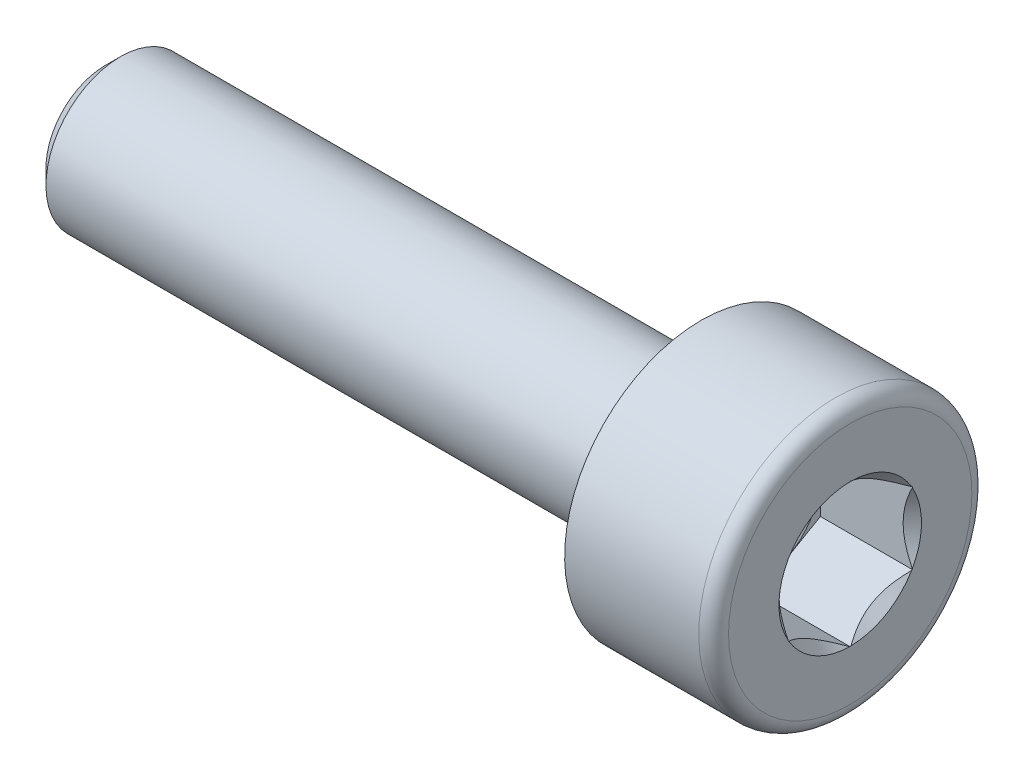
ISO-10303-21;
HEADER;
FILE_DESCRIPTION(('STEP AP214'),'2;1');
FILE_NAME('part.step','',(''),(''),'','','');
FILE_SCHEMA(('AUTOMOTIVE_DESIGN { 1 0 10303 214 1 1 1 1 }'));
ENDSEC;
DATA;
#1=APPLICATION_CONTEXT('core data for automotive mechanical design processes');
#2=APPLICATION_PROTOCOL_DEFINITION('international standard','automotive_design',2000,#1);
#3=PRODUCT_CONTEXT('',#1,'mechanical');
#4=PRODUCT('Part','Part','',(#3));
#5=PRODUCT_RELATED_PRODUCT_CATEGORY('part','',(#4));
#6=PRODUCT_DEFINITION_FORMATION('','',#4);
#7=PRODUCT_DEFINITION_CONTEXT('part definition',#1,'design');
#8=PRODUCT_DEFINITION('design','',#6,#7);
#9=PRODUCT_DEFINITION_SHAPE('','',#8);
#10=(LENGTH_UNIT() NAMED_UNIT(*) SI_UNIT(.MILLI.,.METRE.));
#11=(NAMED_UNIT(*) PLANE_ANGLE_UNIT() SI_UNIT($,.RADIAN.));
#12=(NAMED_UNIT(*) SI_UNIT($,.STERADIAN.) SOLID_ANGLE_UNIT());
#13=UNCERTAINTY_MEASURE_WITH_UNIT(LENGTH_MEASURE(1.E-05),#10,'distance_accuracy_value','');
#14=(GEOMETRIC_REPRESENTATION_CONTEXT(3) GLOBAL_UNCERTAINTY_ASSIGNED_CONTEXT((#13)) GLOBAL_UNIT_ASSIGNED_CONTEXT((#10,
#11,#12)) REPRESENTATION_CONTEXT('',''));
#15=CARTESIAN_POINT('',(0.,0.,0.));
#16=DIRECTION('',(0.,0.,1.));
#17=DIRECTION('',(1.,0.,0.));
#18=AXIS2_PLACEMENT_3D('',#15,#16,#17);
#19=CARTESIAN_POINT('',(7.04489469849211,667.387388585829,-392.357743681073));
#20=DIRECTION('',(-1.,0.,0.));
#21=DIRECTION('',(0.,0.,1.));
#22=AXIS2_PLACEMENT_3D('',#19,#20,#21);
#23=PLANE('',#22);
#24=DIRECTION('',(0.,1.,0.));
#25=VECTOR('',#24,1.);
#26=CARTESIAN_POINT('',(7.04489469849211,668.109076422316,-393.607743681073));
#27=LINE('',#26,#25);
#28=CARTESIAN_POINT('',(7.04489469885591,667.387388585829,-393.607743680855));
#29=VERTEX_POINT('',#28);
#30=CARTESIAN_POINT('',(7.04489469849211,668.109076422316,-393.607743681073));
#31=VERTEX_POINT('',#30);
#32=EDGE_CURVE('E162',#29,#31,#27,.T.);
#33=ORIENTED_EDGE('',*,*,#32,.T.);
#34=DIRECTION('',(0.,0.5,0.866025403784438));
#35=VECTOR('',#34,1.);
#36=CARTESIAN_POINT('',(7.04489469849211,668.830764258803,-392.357743681073));
#37=LINE('',#36,#35);
#38=CARTESIAN_POINT('',(7.04489469885579,668.469920340371,-392.982743680964));
#39=VERTEX_POINT('',#38);
#40=EDGE_CURVE('E158',#31,#39,#37,.T.);
#41=ORIENTED_EDGE('',*,*,#40,.T.);
#42=CARTESIAN_POINT('',(7.04489469921971,667.387388585829,-392.357743681073));
#43=DIRECTION('',(1.,2.16493489877334E-13,0.));
#44=DIRECTION('',(-2.16493489877334E-13,1.,0.));
#45=AXIS2_PLACEMENT_3D('',#42,#43,#44);
#46=CIRCLE('',#45,1.24999999956434);
#47=EDGE_CURVE('E159',#39,#29,#46,.F.);
#48=ORIENTED_EDGE('',*,*,#47,.T.);
#49=EDGE_LOOP('',(#33,#41,#48));
#50=FACE_BOUND('',#49,.T.);
#51=ADVANCED_FACE('F17',(#50),#23,.F.);
#52=CARTESIAN_POINT('',(7.04489469849211,667.387388585829,-392.357743681073));
#53=DIRECTION('',(-1.,0.,0.));
#54=DIRECTION('',(0.,0.,1.));
#55=AXIS2_PLACEMENT_3D('',#52,#53,#54);
#56=PLANE('',#55);
#57=DIRECTION('',(0.,0.5,-0.866025403784439));
#58=VECTOR('',#57,1.);
#59=CARTESIAN_POINT('',(7.04489469849211,666.665700749342,-393.607743681073));
#60=LINE('',#59,#58);
#61=CARTESIAN_POINT('',(7.04489469885608,666.304856831287,-392.982743680964));
#62=VERTEX_POINT('',#61);
#63=CARTESIAN_POINT('',(7.04489469849211,666.665700749342,-393.607743681073));
#64=VERTEX_POINT('',#63);
#65=EDGE_CURVE('E526',#62,#64,#60,.T.);
#66=ORIENTED_EDGE('',*,*,#65,.T.);
#67=DIRECTION('',(0.,1.,0.));
#68=VECTOR('',#67,1.);
#69=CARTESIAN_POINT('',(7.04489469849211,668.109076422316,-393.607743681073));
#70=LINE('',#69,#68);
#71=EDGE_CURVE('E554',#64,#29,#70,.T.);
#72=ORIENTED_EDGE('',*,*,#71,.T.);
#73=CARTESIAN_POINT('',(7.04489469921979,667.387388585829,-392.357743681073));
#74=DIRECTION('',(1.,2.16493489877334E-13,0.));
#75=DIRECTION('',(-2.16493489877334E-13,1.,0.));
#76=AXIS2_PLACEMENT_3D('',#73,#74,#75);
#77=CIRCLE('',#76,1.24999999956449);
#78=EDGE_CURVE('E177',#62,#29,#77,.T.);
#79=ORIENTED_EDGE('',*,*,#78,.F.);
#80=EDGE_LOOP('',(#66,#72,#79));
#81=FACE_BOUND('',#80,.T.);
#82=ADVANCED_FACE('F752',(#81),#56,.F.);
#83=CARTESIAN_POINT('',(7.04489469849211,668.109076422316,-393.607743681073));
#84=DIRECTION('',(0.,0.,-1.));
#85=DIRECTION('',(-1.,0.,0.));
#86=AXIS2_PLACEMENT_3D('',#83,#84,#85);
#87=PLANE('',#86);
#88=DIRECTION('',(0.,1.,0.));
#89=VECTOR('',#88,1.);
#90=CARTESIAN_POINT('',(8.89489469849247,668.109076422316,-393.607743681073));
#91=LINE('',#90,#89);
#92=CARTESIAN_POINT('',(8.89489469849247,668.109076422316,-393.607743681073));
#93=VERTEX_POINT('',#92);
#94=CARTESIAN_POINT('',(8.89489469851025,668.092175787618,-393.607743681073));
#95=VERTEX_POINT('',#94);
#96=EDGE_CURVE('E426',#93,#95,#91,.F.);
#97=ORIENTED_EDGE('',*,*,#96,.F.);
#98=DIRECTION('',(1.,0.,0.));
#99=VECTOR('',#98,1.);
#100=CARTESIAN_POINT('',(7.04489469849211,668.109076422316,-393.607743681073));
#101=LINE('',#100,#99);
#102=EDGE_CURVE('E167',#93,#31,#101,.F.);
#103=ORIENTED_EDGE('',*,*,#102,.T.);
#104=ORIENTED_EDGE('',*,*,#32,.F.);
#105=ORIENTED_EDGE('',*,*,#71,.F.);
#106=DIRECTION('',(1.,0.,0.));
#107=VECTOR('',#106,1.);
#108=CARTESIAN_POINT('',(7.04489469849211,666.665700749342,-393.607743681073));
#109=LINE('',#108,#107);
#110=CARTESIAN_POINT('',(8.89489469849247,666.665700749342,-393.607743681073));
#111=VERTEX_POINT('',#110);
#112=EDGE_CURVE('E516',#64,#111,#109,.T.);
#113=ORIENTED_EDGE('',*,*,#112,.T.);
#114=DIRECTION('',(0.,1.,0.));
#115=VECTOR('',#114,1.);
#116=CARTESIAN_POINT('',(8.89489469849247,668.109076422316,-393.607743681073));
#117=LINE('',#116,#115);
#118=CARTESIAN_POINT('',(8.89489469854452,666.682601383971,-393.607743681073));
#119=VERTEX_POINT('',#118);
#120=EDGE_CURVE('E180',#119,#111,#117,.F.);
#121=ORIENTED_EDGE('',*,*,#120,.F.);
#122=CARTESIAN_POINT('',(8.89489469855653,668.092175787723,-393.607743681083));
#123=CARTESIAN_POINT('',(8.87117991321069,668.043852206225,-393.607743681077));
#124=CARTESIAN_POINT('',(8.84888923016779,667.994735198403,-393.607743681074));
#125=CARTESIAN_POINT('',(8.80810287962849,667.894617644953,-393.607743681072));
#126=CARTESIAN_POINT('',(8.78963092965057,667.843607520204,-393.607743681073));
#127=CARTESIAN_POINT('',(8.75780168763492,667.740186947449,-393.607743681073));
#128=CARTESIAN_POINT('',(8.74442526083751,667.687782544966,-393.607743681073));
#129=CARTESIAN_POINT('',(8.72387497718193,667.581876028171,-393.607743681073));
#130=CARTESIAN_POINT('',(8.71668293816054,667.528377608385,-393.607743681073));
#131=CARTESIAN_POINT('',(8.7119254865228,667.460145309228,-393.607743681073));
#132=CARTESIAN_POINT('',(8.71116480000057,667.445601189561,-393.607743681073));
#133=CARTESIAN_POINT('',(8.71014928371903,667.416501583289,-393.607743681073));
#134=CARTESIAN_POINT('',(8.70989422450401,667.40194610484,-393.607743681073));
#135=CARTESIAN_POINT('',(8.70989593302582,667.349450798178,-393.607743681073));
#136=CARTESIAN_POINT('',(8.71163263441981,667.311499151935,-393.607743681073));
#137=CARTESIAN_POINT('',(8.71847634230468,667.23589199948,-393.607743681073));
#138=CARTESIAN_POINT('',(8.72358572479567,667.198236720992,-393.607743681073));
#139=CARTESIAN_POINT('',(8.74365016608514,667.085788613579,-393.607743681073));
#140=CARTESIAN_POINT('',(8.76333829122689,667.011814111726,-393.607743681073));
#141=CARTESIAN_POINT('',(8.80260390054921,666.895327043362,-393.607743681073));
#142=CARTESIAN_POINT('',(8.8192568604464,666.851749692749,-393.607743681073));
#143=CARTESIAN_POINT('',(8.85523377783338,666.766143984923,-393.607743681073));
#144=CARTESIAN_POINT('',(8.87453358296473,666.724105542843,-393.607743681073));
#145=CARTESIAN_POINT('',(8.89489469856133,666.682601383936,-393.607743681073));
#146=B_SPLINE_CURVE_WITH_KNOTS('',3,(#122,#123,#124,#125,#126,#127,#128,#129,#130,#131,#132,
#133,#134,#135,#136,#137,#138,#139,#140,#141,#142,#143,#144,#145),.UNSPECIFIED.,.F.,.F.,(4,2,2,
2,2,2,2,2,2,2,2,4),(0.,0.16159297621972,0.324161275223104,0.486112932561708,0.647586806321818,
0.691272786612427,0.734938937487817,0.848735605601851,0.962612527337378,1.19125625199596,
1.33113310615987,1.46980937847075),.UNSPECIFIED.);
#147=EDGE_CURVE('E421',#95,#119,#146,.T.);
#148=ORIENTED_EDGE('',*,*,#147,.F.);
#149=EDGE_LOOP('',(#97,#103,#104,#105,#113,#121,#148));
#150=FACE_BOUND('',#149,.T.);
#151=ADVANCED_FACE('F412',(#150),#87,.F.);
#152=CARTESIAN_POINT('',(7.04489469849211,668.830764258803,-392.357743681073));
#153=DIRECTION('',(0.,0.866025403784438,-0.5));
#154=DIRECTION('',(0.,0.5,0.866025403784438));
#155=AXIS2_PLACEMENT_3D('',#152,#153,#154);
#156=PLANE('',#155);
#157=DIRECTION('',(1.,0.,0.));
#158=VECTOR('',#157,1.);
#159=CARTESIAN_POINT('',(7.04489469849211,668.830764258803,-392.357743681073));
#160=LINE('',#159,#158);
#161=CARTESIAN_POINT('',(8.89489469849247,668.830764258803,-392.357743681073));
#162=VERTEX_POINT('',#161);
#163=CARTESIAN_POINT('',(7.04489469849211,668.830764258803,-392.357743681073));
#164=VERTEX_POINT('',#163);
#165=EDGE_CURVE('E172',#162,#164,#160,.F.);
#166=ORIENTED_EDGE('',*,*,#165,.T.);
#167=DIRECTION('',(0.,-0.499999999999534,-0.866025403784707));
#168=VECTOR('',#167,1.);
#169=CARTESIAN_POINT('',(7.04489469849211,668.830764258803,-392.357743681073));
#170=LINE('',#169,#168);
#171=EDGE_CURVE('E146',#164,#39,#170,.T.);
#172=ORIENTED_EDGE('',*,*,#171,.T.);
#173=ORIENTED_EDGE('',*,*,#40,.F.);
#174=ORIENTED_EDGE('',*,*,#102,.F.);
#175=DIRECTION('',(0.,0.5,0.866025403784438));
#176=VECTOR('',#175,1.);
#177=CARTESIAN_POINT('',(8.89489469849247,668.830764258803,-392.357743681073));
#178=LINE('',#177,#176);
#179=CARTESIAN_POINT('',(8.89489469854436,668.11752673963,-393.593107302144));
#180=VERTEX_POINT('',#179);
#181=EDGE_CURVE('E420',#180,#93,#178,.F.);
#182=ORIENTED_EDGE('',*,*,#181,.F.);
#183=CARTESIAN_POINT('',(8.89489469855646,668.822313941515,-392.372380059975));
#184=CARTESIAN_POINT('',(8.87117991321007,668.798152150761,-392.414229509152));
#185=CARTESIAN_POINT('',(8.84888923016683,668.773593646847,-392.456766085683));
#186=CARTESIAN_POINT('',(8.80810287962714,668.723534870119,-392.543470430336));
#187=CARTESIAN_POINT('',(8.78963092964915,668.698029807744,-392.58764649422));
#188=CARTESIAN_POINT('',(8.7578016876337,668.646319521368,-392.6772113375));
#189=CARTESIAN_POINT('',(8.7444252608364,668.620117320127,-392.72259488132));
#190=CARTESIAN_POINT('',(8.72387497718203,668.567164061729,-392.814312615289));
#191=CARTESIAN_POINT('',(8.71668293816175,668.540414851835,-392.860643605883));
#192=CARTESIAN_POINT('',(8.7119254865224,668.50629870226,-392.919734510313));
#193=CARTESIAN_POINT('',(8.71116479999966,668.499026642427,-392.932330087422));
#194=CARTESIAN_POINT('',(8.71014928371984,668.484476839288,-392.957531085692));
#195=CARTESIAN_POINT('',(8.70989422450707,668.477199100059,-392.97013649979));
#196=CARTESIAN_POINT('',(8.70989593303279,668.450951446719,-393.015598768934));
#197=CARTESIAN_POINT('',(8.71163263442171,668.431975623608,-393.048465858702));
#198=CARTESIAN_POINT('',(8.71847634230282,668.394172047388,-393.113943573441));
#199=CARTESIAN_POINT('',(8.72358572479509,668.375344408142,-393.146554001196));
#200=CARTESIAN_POINT('',(8.74365016608657,668.319120354432,-393.243936918821));
#201=CARTESIAN_POINT('',(8.7633382912272,668.282133103507,-393.308000716659));
#202=CARTESIAN_POINT('',(8.80260390054881,668.223889569326,-393.408881477075));
#203=CARTESIAN_POINT('',(8.81925686044601,668.20210089402,-393.446620569735));
#204=CARTESIAN_POINT('',(8.85523377783316,668.159298040107,-393.520757287421));
#205=CARTESIAN_POINT('',(8.87453358296468,668.138278819066,-393.557163646198));
#206=CARTESIAN_POINT('',(8.89489469856121,668.117526739613,-393.593107302174));
#207=B_SPLINE_CURVE_WITH_KNOTS('',3,(#183,#184,#185,#186,#187,#188,#189,#190,#191,#192,#193,
#194,#195,#196,#197,#198,#199,#200,#201,#202,#203,#204,#205,#206),.UNSPECIFIED.,.F.,.F.,(4,2,2,
2,2,2,2,2,2,2,2,4),(0.,0.16159297622278,0.324161275228295,0.486112932563936,0.64758680632166,
0.691272786612252,0.734938937487788,0.848735605602835,0.962612527338137,1.19125625199554,
1.33113310615905,1.46980937847057),.UNSPECIFIED.);
#208=CARTESIAN_POINT('',(8.89489469851013,668.822313941454,-392.372380060062));
#209=VERTEX_POINT('',#208);
#210=EDGE_CURVE('E415',#209,#180,#207,.T.);
#211=ORIENTED_EDGE('',*,*,#210,.F.);
#212=DIRECTION('',(0.,0.5,0.866025403784438));
#213=VECTOR('',#212,1.);
#214=CARTESIAN_POINT('',(8.89489469849247,668.830764258803,-392.357743681073));
#215=LINE('',#214,#213);
#216=EDGE_CURVE('E166',#162,#209,#215,.F.);
#217=ORIENTED_EDGE('',*,*,#216,.F.);
#218=EDGE_LOOP('',(#166,#172,#173,#174,#182,#211,#217));
#219=FACE_BOUND('',#218,.T.);
#220=ADVANCED_FACE('F169',(#219),#156,.F.);
#221=CARTESIAN_POINT('',(7.04489469849211,667.387388585829,-392.357743681073));
#222=DIRECTION('',(-1.,0.,0.));
#223=DIRECTION('',(0.,0.,1.));
#224=AXIS2_PLACEMENT_3D('',#221,#222,#223);
#225=PLANE('',#224);
#226=ORIENTED_EDGE('',*,*,#171,.F.);
#227=DIRECTION('',(0.,-0.5,0.866025403784439));
#228=VECTOR('',#227,1.);
#229=CARTESIAN_POINT('',(7.04489469849211,668.109076422316,-391.107743681073));
#230=LINE('',#229,#228);
#231=CARTESIAN_POINT('',(7.04489469885578,668.469920340371,-391.732743681182));
#232=VERTEX_POINT('',#231);
#233=EDGE_CURVE('E148',#164,#232,#230,.T.);
#234=ORIENTED_EDGE('',*,*,#233,.T.);
#235=CARTESIAN_POINT('',(7.04489469921969,667.387388585829,-392.357743681073));
#236=DIRECTION('',(1.,2.16493489877334E-13,0.));
#237=DIRECTION('',(-2.16493489877334E-13,1.,0.));
#238=AXIS2_PLACEMENT_3D('',#235,#236,#237);
#239=CIRCLE('',#238,1.24999999956431);
#240=EDGE_CURVE('E142',#232,#39,#239,.F.);
#241=ORIENTED_EDGE('',*,*,#240,.T.);
#242=EDGE_LOOP('',(#226,#234,#241));
#243=FACE_BOUND('',#242,.T.);
#244=ADVANCED_FACE('F144',(#243),#225,.F.);
#245=CARTESIAN_POINT('',(7.04489469921982,667.387388585829,-392.357743681073));
#246=DIRECTION('',(1.,2.16493489877334E-13,0.));
#247=DIRECTION('',(-2.16493489877334E-13,1.,0.));
#248=AXIS2_PLACEMENT_3D('',#245,#246,#247);
#249=CONICAL_SURFACE('',#248,1.24999999956454,1.04719755000191);
#250=CARTESIAN_POINT('',(7.04489469921982,667.387388585829,-392.357743681073));
#251=DIRECTION('',(1.,2.16493489877334E-13,0.));
#252=DIRECTION('',(-2.16493489877334E-13,1.,0.));
#253=AXIS2_PLACEMENT_3D('',#250,#251,#252);
#254=CIRCLE('',#253,1.24999999956454);
#255=CARTESIAN_POINT('',(7.04489469885607,666.304856831287,-391.732743681182));
#256=VERTEX_POINT('',#255);
#257=EDGE_CURVE('E153',#256,#62,#254,.T.);
#258=ORIENTED_EDGE('',*,*,#257,.T.);
#259=ORIENTED_EDGE('',*,*,#78,.T.);
#260=ORIENTED_EDGE('',*,*,#47,.F.);
#261=ORIENTED_EDGE('',*,*,#240,.F.);
#262=CARTESIAN_POINT('',(7.04489469921976,667.387388585829,-392.357743681073));
#263=DIRECTION('',(1.,2.16493489877334E-13,0.));
#264=DIRECTION('',(-2.16493489877334E-13,1.,0.));
#265=AXIS2_PLACEMENT_3D('',#262,#263,#264);
#266=CIRCLE('',#265,1.24999999956443);
#267=CARTESIAN_POINT('',(7.04489469885594,667.387388585829,-391.107743681291));
#268=VERTEX_POINT('',#267);
#269=EDGE_CURVE('E380',#232,#268,#266,.T.);
#270=ORIENTED_EDGE('',*,*,#269,.T.);
#271=CARTESIAN_POINT('',(7.04489469921979,667.387388585829,-392.357743681073));
#272=DIRECTION('',(1.,2.16493489877334E-13,0.));
#273=DIRECTION('',(-2.16493489877334E-13,1.,0.));
#274=AXIS2_PLACEMENT_3D('',#271,#272,#273);
#275=CIRCLE('',#274,1.24999999956449);
#276=EDGE_CURVE('E789',#268,#256,#275,.T.);
#277=ORIENTED_EDGE('',*,*,#276,.T.);
#278=EDGE_LOOP('',(#258,#259,#260,#261,#270,#277));
#279=FACE_BOUND('',#278,.T.);
#280=CARTESIAN_POINT('',(6.32320686105459,667.387388585809,-392.357743681073));
#281=VERTEX_POINT('',#280);
#282=VERTEX_LOOP('',#281);
#283=FACE_BOUND('',#282,.T.);
#284=ADVANCED_FACE('F174',(#279,#283),#249,.F.);
#285=CARTESIAN_POINT('',(7.04489469849211,667.387388585829,-392.357743681073));
#286=DIRECTION('',(-1.,0.,0.));
#287=DIRECTION('',(0.,0.,1.));
#288=AXIS2_PLACEMENT_3D('',#285,#286,#287);
#289=PLANE('',#288);
#290=DIRECTION('',(0.,-0.5,-0.866025403784438));
#291=VECTOR('',#290,1.);
#292=CARTESIAN_POINT('',(7.04489469849211,665.944012912855,-392.357743681073));
#293=LINE('',#292,#291);
#294=CARTESIAN_POINT('',(7.04489469849211,665.944012912855,-392.357743681073));
#295=VERTEX_POINT('',#294);
#296=EDGE_CURVE('E511',#256,#295,#293,.T.);
#297=ORIENTED_EDGE('',*,*,#296,.T.);
#298=DIRECTION('',(0.,0.5,-0.866025403784439));
#299=VECTOR('',#298,1.);
#300=CARTESIAN_POINT('',(7.04489469849211,666.665700749342,-393.607743681073));
#301=LINE('',#300,#299);
#302=EDGE_CURVE('E521',#295,#62,#301,.T.);
#303=ORIENTED_EDGE('',*,*,#302,.T.);
#304=ORIENTED_EDGE('',*,*,#257,.F.);
#305=EDGE_LOOP('',(#297,#303,#304));
#306=FACE_BOUND('',#305,.T.);
#307=ADVANCED_FACE('F400',(#306),#289,.F.);
#308=CARTESIAN_POINT('',(7.04489469849211,666.665700749342,-393.607743681073));
#309=DIRECTION('',(0.,-0.866025403784439,-0.5));
#310=DIRECTION('',(0.,0.5,-0.866025403784439));
#311=AXIS2_PLACEMENT_3D('',#308,#309,#310);
#312=PLANE('',#311);
#313=ORIENTED_EDGE('',*,*,#112,.F.);
#314=ORIENTED_EDGE('',*,*,#65,.F.);
#315=ORIENTED_EDGE('',*,*,#302,.F.);
#316=DIRECTION('',(1.,0.,0.));
#317=VECTOR('',#316,1.);
#318=CARTESIAN_POINT('',(7.04489469849211,665.944012912855,-392.357743681073));
#319=LINE('',#318,#317);
#320=CARTESIAN_POINT('',(8.89489469849247,665.944012912855,-392.357743681073));
#321=VERTEX_POINT('',#320);
#322=EDGE_CURVE('E507',#295,#321,#319,.T.);
#323=ORIENTED_EDGE('',*,*,#322,.T.);
#324=DIRECTION('',(0.,0.5,-0.866025403784439));
#325=VECTOR('',#324,1.);
#326=CARTESIAN_POINT('',(8.89489469849247,666.665700749342,-393.607743681073));
#327=LINE('',#326,#325);
#328=CARTESIAN_POINT('',(8.89489469854463,665.952463230169,-392.372380060001));
#329=VERTEX_POINT('',#328);
#330=EDGE_CURVE('E519',#329,#321,#327,.F.);
#331=ORIENTED_EDGE('',*,*,#330,.F.);
#332=CARTESIAN_POINT('',(8.89489469855656,666.657250432037,-393.593107302181));
#333=CARTESIAN_POINT('',(8.87117991321015,666.633088641293,-393.551257852998));
#334=CARTESIAN_POINT('',(8.84888923016688,666.608530137384,-393.508721276464));
#335=CARTESIAN_POINT('',(8.80810287962716,666.55847136066,-393.422016931808));
#336=CARTESIAN_POINT('',(8.78963092964917,666.532966298284,-393.377840867925));
#337=CARTESIAN_POINT('',(8.75780168763371,666.481256011906,-393.288276024646));
#338=CARTESIAN_POINT('',(8.74442526083641,666.455053810665,-393.242892480827));
#339=CARTESIAN_POINT('',(8.72387497718203,666.40210055227,-393.151174746856));
#340=CARTESIAN_POINT('',(8.71668293816174,666.375351342379,-393.104843756259));
#341=CARTESIAN_POINT('',(8.71192548652239,666.341235192798,-393.045752851833));
#342=CARTESIAN_POINT('',(8.71116479999964,666.333963132963,-393.033157274726));
#343=CARTESIAN_POINT('',(8.71014928371983,666.31941332983,-393.007956276452));
#344=CARTESIAN_POINT('',(8.70989422450707,666.31213559061,-392.995350862349));
#345=CARTESIAN_POINT('',(8.70989593303282,666.285887937287,-392.949888593195));
#346=CARTESIAN_POINT('',(8.71163263442173,666.266912114155,-392.917021503439));
#347=CARTESIAN_POINT('',(8.71847634230284,666.229108537919,-392.851543788709));
#348=CARTESIAN_POINT('',(8.72358572479512,666.210280898678,-392.818933360951));
#349=CARTESIAN_POINT('',(8.74365016608663,666.154056844976,-392.721550443322));
#350=CARTESIAN_POINT('',(8.76333829122726,666.117069594048,-392.657486645486));
#351=CARTESIAN_POINT('',(8.80260390054891,666.058826059865,-392.556605885071));
#352=CARTESIAN_POINT('',(8.81925686044612,666.037037384559,-392.518866792411));
#353=CARTESIAN_POINT('',(8.85523377783327,665.994234530646,-392.444730074725));
#354=CARTESIAN_POINT('',(8.87453358296478,665.973215309606,-392.408323715948));
#355=CARTESIAN_POINT('',(8.89489469856129,665.952463230152,-392.372380059972));
#356=B_SPLINE_CURVE_WITH_KNOTS('',3,(#332,#333,#334,#335,#336,#337,#338,#339,#340,#341,#342,
#343,#344,#345,#346,#347,#348,#349,#350,#351,#352,#353,#354,#355),.UNSPECIFIED.,.F.,.F.,(4,2,2,
2,2,2,2,2,2,2,2,4),(0.,0.161592976222928,0.324161275228348,0.486112932563992,0.647586806321766,
0.691272786612461,0.734938937488176,0.848735605603044,0.962612527338349,1.19125625199572,
1.33113310615914,1.46980937847056),.UNSPECIFIED.);
#357=CARTESIAN_POINT('',(8.89489469851036,666.657250431993,-393.593107302084));
#358=VERTEX_POINT('',#357);
#359=EDGE_CURVE('E381',#358,#329,#356,.T.);
#360=ORIENTED_EDGE('',*,*,#359,.F.);
#361=DIRECTION('',(0.,0.5,-0.866025403784439));
#362=VECTOR('',#361,1.);
#363=CARTESIAN_POINT('',(8.89489469849247,666.665700749342,-393.607743681073));
#364=LINE('',#363,#362);
#365=EDGE_CURVE('E379',#111,#358,#364,.F.);
#366=ORIENTED_EDGE('',*,*,#365,.F.);
#367=EDGE_LOOP('',(#313,#314,#315,#323,#331,#360,#366));
#368=FACE_BOUND('',#367,.T.);
#369=ADVANCED_FACE('F394',(#368),#312,.F.);
#370=CARTESIAN_POINT('',(7.04489469849211,668.109076422316,-391.107743681073));
#371=DIRECTION('',(0.,0.866025403784439,0.5));
#372=DIRECTION('',(0.,-0.5,0.866025403784439));
#373=AXIS2_PLACEMENT_3D('',#370,#371,#372);
#374=PLANE('',#373);
#375=DIRECTION('',(1.,0.,0.));
#376=VECTOR('',#375,1.);
#377=CARTESIAN_POINT('',(7.04489469849211,668.109076422316,-391.107743681073));
#378=LINE('',#377,#376);
#379=CARTESIAN_POINT('',(8.89489469849247,668.109076422316,-391.107743681073));
#380=VERTEX_POINT('',#379);
#381=CARTESIAN_POINT('',(7.04489469849211,668.109076422316,-391.107743681073));
#382=VERTEX_POINT('',#381);
#383=EDGE_CURVE('E798',#380,#382,#378,.F.);
#384=ORIENTED_EDGE('',*,*,#383,.T.);
#385=DIRECTION('',(0.,0.50000000000049,-0.866025403784155));
#386=VECTOR('',#385,1.);
#387=CARTESIAN_POINT('',(7.04489469849211,668.109076422316,-391.107743681073));
#388=LINE('',#387,#386);
#389=EDGE_CURVE('E819',#382,#232,#388,.T.);
#390=ORIENTED_EDGE('',*,*,#389,.T.);
#391=ORIENTED_EDGE('',*,*,#233,.F.);
#392=ORIENTED_EDGE('',*,*,#165,.F.);
#393=DIRECTION('',(0.,-0.5,0.866025403784439));
#394=VECTOR('',#393,1.);
#395=CARTESIAN_POINT('',(8.89489469849247,668.109076422316,-391.107743681073));
#396=LINE('',#395,#394);
#397=CARTESIAN_POINT('',(8.89489469854432,668.822313941489,-392.343107302145));
#398=VERTEX_POINT('',#397);
#399=EDGE_CURVE('E378',#398,#162,#396,.F.);
#400=ORIENTED_EDGE('',*,*,#399,.F.);
#401=CARTESIAN_POINT('',(8.89489469855649,668.117526739621,-391.122380059965));
#402=CARTESIAN_POINT('',(8.87117991321008,668.141688530365,-391.164229509148));
#403=CARTESIAN_POINT('',(8.84888923016683,668.166247034274,-391.206766085682));
#404=CARTESIAN_POINT('',(8.80810287962712,668.216305810998,-391.293470430337));
#405=CARTESIAN_POINT('',(8.78963092964914,668.241810873374,-391.337646494221));
#406=CARTESIAN_POINT('',(8.75780168763369,668.293521159752,-391.427211337499));
#407=CARTESIAN_POINT('',(8.74442526083639,668.319723360993,-391.472594881319));
#408=CARTESIAN_POINT('',(8.723874977182,668.372676619388,-391.564312615289));
#409=CARTESIAN_POINT('',(8.71668293816171,668.399425829279,-391.610643605886));
#410=CARTESIAN_POINT('',(8.71192548652236,668.43354197886,-391.669734510312));
#411=CARTESIAN_POINT('',(8.71116479999961,668.440814038695,-391.68233008742));
#412=CARTESIAN_POINT('',(8.71014928371978,668.455363841828,-391.707531085694));
#413=CARTESIAN_POINT('',(8.709894224507,668.462641581048,-391.720136499797));
#414=CARTESIAN_POINT('',(8.70989593303271,668.488889234371,-391.765598768951));
#415=CARTESIAN_POINT('',(8.71163263442168,668.507865057503,-391.798465858707));
#416=CARTESIAN_POINT('',(8.71847634230283,668.545668633739,-391.863943573437));
#417=CARTESIAN_POINT('',(8.72358572479509,668.56449627298,-391.896554001195));
#418=CARTESIAN_POINT('',(8.74365016608659,668.620720326682,-391.993936918825));
#419=CARTESIAN_POINT('',(8.76333829122726,668.657707577611,-392.05800071666));
#420=CARTESIAN_POINT('',(8.80260390054891,668.715951111794,-392.158881477075));
#421=CARTESIAN_POINT('',(8.8192568604461,668.737739787099,-392.196620569735));
#422=CARTESIAN_POINT('',(8.85523377783319,668.780542641012,-392.270757287421));
#423=CARTESIAN_POINT('',(8.87453358296466,668.801561862052,-392.307163646198));
#424=CARTESIAN_POINT('',(8.89489469856114,668.822313941506,-392.343107302174));
#425=B_SPLINE_CURVE_WITH_KNOTS('',3,(#401,#402,#403,#404,#405,#406,#407,#408,#409,#410,#411,
#412,#413,#414,#415,#416,#417,#418,#419,#420,#421,#422,#423,#424),.UNSPECIFIED.,.F.,.F.,(4,2,2,
2,2,2,2,2,2,2,2,4),(0.,0.161592976222783,0.324161275228253,0.486112932563795,0.647586806321522,
0.691272786612417,0.734938937488181,0.848735605603251,0.962612527338556,1.19125625199614,
1.33113310615939,1.46980937847062),.UNSPECIFIED.);
#426=CARTESIAN_POINT('',(8.89489469851017,668.117526739665,-391.122380060062));
#427=VERTEX_POINT('',#426);
#428=EDGE_CURVE('E370',#427,#398,#425,.T.);
#429=ORIENTED_EDGE('',*,*,#428,.F.);
#430=DIRECTION('',(0.,-0.5,0.866025403784439));
#431=VECTOR('',#430,1.);
#432=CARTESIAN_POINT('',(8.89489469849247,668.109076422316,-391.107743681073));
#433=LINE('',#432,#431);
#434=EDGE_CURVE('E498',#380,#427,#433,.F.);
#435=ORIENTED_EDGE('',*,*,#434,.F.);
#436=EDGE_LOOP('',(#384,#390,#391,#392,#400,#429,#435));
#437=FACE_BOUND('',#436,.T.);
#438=ADVANCED_FACE('F389',(#437),#374,.F.);
#439=CARTESIAN_POINT('',(7.04489469849211,667.387388585829,-392.357743681073));
#440=DIRECTION('',(-1.,0.,0.));
#441=DIRECTION('',(0.,0.,1.));
#442=AXIS2_PLACEMENT_3D('',#439,#440,#441);
#443=PLANE('',#442);
#444=ORIENTED_EDGE('',*,*,#389,.F.);
#445=DIRECTION('',(0.,1.,0.));
#446=VECTOR('',#445,1.);
#447=CARTESIAN_POINT('',(7.04489469849211,666.665700749342,-391.107743681073));
#448=LINE('',#447,#446);
#449=EDGE_CURVE('E812',#382,#268,#448,.F.);
#450=ORIENTED_EDGE('',*,*,#449,.T.);
#451=ORIENTED_EDGE('',*,*,#269,.F.);
#452=EDGE_LOOP('',(#444,#450,#451));
#453=FACE_BOUND('',#452,.T.);
#454=ADVANCED_FACE('F393',(#453),#443,.F.);
#455=CARTESIAN_POINT('',(7.04489469849211,667.387388585829,-392.357743681073));
#456=DIRECTION('',(-1.,0.,0.));
#457=DIRECTION('',(0.,0.,1.));
#458=AXIS2_PLACEMENT_3D('',#455,#456,#457);
#459=PLANE('',#458);
#460=DIRECTION('',(0.,1.,0.));
#461=VECTOR('',#460,1.);
#462=CARTESIAN_POINT('',(7.04489469849211,666.665700749342,-391.107743681073));
#463=LINE('',#462,#461);
#464=CARTESIAN_POINT('',(7.04489469849211,666.665700749342,-391.107743681073));
#465=VERTEX_POINT('',#464);
#466=EDGE_CURVE('E337',#268,#465,#463,.F.);
#467=ORIENTED_EDGE('',*,*,#466,.T.);
#468=DIRECTION('',(0.,-0.5,-0.866025403784438));
#469=VECTOR('',#468,1.);
#470=CARTESIAN_POINT('',(7.04489469849211,665.944012912855,-392.357743681073));
#471=LINE('',#470,#469);
#472=EDGE_CURVE('E530',#465,#256,#471,.T.);
#473=ORIENTED_EDGE('',*,*,#472,.T.);
#474=ORIENTED_EDGE('',*,*,#276,.F.);
#475=EDGE_LOOP('',(#467,#473,#474));
#476=FACE_BOUND('',#475,.T.);
#477=ADVANCED_FACE('F700',(#476),#459,.F.);
#478=CARTESIAN_POINT('',(7.04489469849211,665.944012912855,-392.357743681073));
#479=DIRECTION('',(0.,-0.866025403784438,0.5));
#480=DIRECTION('',(0.,-0.5,-0.866025403784438));
#481=AXIS2_PLACEMENT_3D('',#478,#479,#480);
#482=PLANE('',#481);
#483=ORIENTED_EDGE('',*,*,#322,.F.);
#484=ORIENTED_EDGE('',*,*,#296,.F.);
#485=ORIENTED_EDGE('',*,*,#472,.F.);
#486=DIRECTION('',(1.,0.,0.));
#487=VECTOR('',#486,1.);
#488=CARTESIAN_POINT('',(7.04489469849211,666.665700749342,-391.107743681073));
#489=LINE('',#488,#487);
#490=CARTESIAN_POINT('',(8.89489469849247,666.665700749342,-391.107743681073));
#491=VERTEX_POINT('',#490);
#492=EDGE_CURVE('E331',#465,#491,#489,.T.);
#493=ORIENTED_EDGE('',*,*,#492,.T.);
#494=DIRECTION('',(0.,-0.5,-0.866025403784438));
#495=VECTOR('',#494,1.);
#496=CARTESIAN_POINT('',(8.89489469849247,665.944012912855,-392.357743681073));
#497=LINE('',#496,#495);
#498=CARTESIAN_POINT('',(8.89489469854462,666.657250432028,-391.122380060001));
#499=VERTEX_POINT('',#498);
#500=EDGE_CURVE('E804',#499,#491,#497,.F.);
#501=ORIENTED_EDGE('',*,*,#500,.F.);
#502=CARTESIAN_POINT('',(8.89489469855659,665.952463230143,-392.34310730217));
#503=CARTESIAN_POINT('',(8.8711799132102,665.976625020897,-392.301257852994));
#504=CARTESIAN_POINT('',(8.84888923016697,666.001183524811,-392.258721276463));
#505=CARTESIAN_POINT('',(8.80810287962728,666.051242301539,-392.17201693181));
#506=CARTESIAN_POINT('',(8.7896309296493,666.076747363914,-392.127840867926));
#507=CARTESIAN_POINT('',(8.75780168763383,666.12845765029,-392.038276024646));
#508=CARTESIAN_POINT('',(8.74442526083652,666.154659851531,-391.992892480826));
#509=CARTESIAN_POINT('',(8.72387497718211,666.207613109929,-391.901174746858));
#510=CARTESIAN_POINT('',(8.71668293816181,666.234362319823,-391.854843756263));
#511=CARTESIAN_POINT('',(8.71192548652243,666.268478469398,-391.795752851833));
#512=CARTESIAN_POINT('',(8.71116479999968,666.27575052923,-391.783157274724));
#513=CARTESIAN_POINT('',(8.71014928371986,666.29030033237,-391.757956276455));
#514=CARTESIAN_POINT('',(8.7098942245071,666.297578071599,-391.745350862357));
#515=CARTESIAN_POINT('',(8.70989593303283,666.323825724939,-391.699888593212));
#516=CARTESIAN_POINT('',(8.71163263442173,666.34280154805,-391.667021503444));
#517=CARTESIAN_POINT('',(8.71847634230282,666.38060512427,-391.601543788705));
#518=CARTESIAN_POINT('',(8.72358572479508,666.399432763516,-391.56893336095));
#519=CARTESIAN_POINT('',(8.74365016608655,666.455656817226,-391.471550443325));
#520=CARTESIAN_POINT('',(8.76333829122715,666.49264406815,-391.407486645487));
#521=CARTESIAN_POINT('',(8.80260390054877,666.550887602331,-391.306605885071));
#522=CARTESIAN_POINT('',(8.819256860446,666.572676277638,-391.268866792412));
#523=CARTESIAN_POINT('',(8.8552337778332,666.615479131551,-391.194730074725));
#524=CARTESIAN_POINT('',(8.87453358296475,666.636498352592,-391.158323715948));
#525=CARTESIAN_POINT('',(8.8948946985613,666.657250432045,-391.122380059972));
#526=B_SPLINE_CURVE_WITH_KNOTS('',3,(#502,#503,#504,#505,#506,#507,#508,#509,#510,#511,#512,
#513,#514,#515,#516,#517,#518,#519,#520,#521,#522,#523,#524,#525),.UNSPECIFIED.,.F.,.F.,(4,2,2,
2,2,2,2,2,2,2,2,4),(0.,0.161592976222687,0.324161275228063,0.486112932563717,0.647586806321346,
0.691272786612042,0.73493893748773,0.848735605602775,0.962612527337972,1.19125625199528,
1.33113310615889,1.46980937847062),.UNSPECIFIED.);
#527=CARTESIAN_POINT('',(8.8948946985104,665.952463230204,-392.343107302084));
#528=VERTEX_POINT('',#527);
#529=EDGE_CURVE('E347',#528,#499,#526,.T.);
#530=ORIENTED_EDGE('',*,*,#529,.F.);
#531=DIRECTION('',(0.,-0.5,-0.866025403784438));
#532=VECTOR('',#531,1.);
#533=CARTESIAN_POINT('',(8.89489469849247,665.944012912855,-392.357743681073));
#534=LINE('',#533,#532);
#535=EDGE_CURVE('E510',#321,#528,#534,.F.);
#536=ORIENTED_EDGE('',*,*,#535,.F.);
#537=EDGE_LOOP('',(#483,#484,#485,#493,#501,#530,#536));
#538=FACE_BOUND('',#537,.T.);
#539=ADVANCED_FACE('F693',(#538),#482,.F.);
#540=CARTESIAN_POINT('',(7.04489469849211,666.665700749342,-391.107743681073));
#541=DIRECTION('',(0.,0.,1.));
#542=DIRECTION('',(1.,0.,0.));
#543=AXIS2_PLACEMENT_3D('',#540,#541,#542);
#544=PLANE('',#543);
#545=ORIENTED_EDGE('',*,*,#492,.F.);
#546=ORIENTED_EDGE('',*,*,#466,.F.);
#547=ORIENTED_EDGE('',*,*,#449,.F.);
#548=ORIENTED_EDGE('',*,*,#383,.F.);
#549=DIRECTION('',(0.,1.,0.));
#550=VECTOR('',#549,1.);
#551=CARTESIAN_POINT('',(8.89489469849247,666.665700749342,-391.107743681073));
#552=LINE('',#551,#550);
#553=CARTESIAN_POINT('',(8.89489469852639,668.092175787651,-391.107743681073));
#554=VERTEX_POINT('',#553);
#555=EDGE_CURVE('E796',#554,#380,#552,.T.);
#556=ORIENTED_EDGE('',*,*,#555,.F.);
#557=CARTESIAN_POINT('',(8.89489469855618,668.092175787722,-391.107743681064));
#558=CARTESIAN_POINT('',(8.87117991321024,668.043852206224,-391.10774368107));
#559=CARTESIAN_POINT('',(8.84888923016734,667.994735198402,-391.107743681072));
#560=CARTESIAN_POINT('',(8.80810287962812,667.894617644952,-391.107743681074));
#561=CARTESIAN_POINT('',(8.78963092965029,667.843607520203,-391.107743681073));
#562=CARTESIAN_POINT('',(8.75780168763476,667.740186947449,-391.107743681073));
#563=CARTESIAN_POINT('',(8.74442526083739,667.687782544966,-391.107743681073));
#564=CARTESIAN_POINT('',(8.72387497718187,667.581876028171,-391.107743681073));
#565=CARTESIAN_POINT('',(8.71668293816049,667.528377608385,-391.107743681073));
#566=CARTESIAN_POINT('',(8.71192548652275,667.460145309228,-391.107743681073));
#567=CARTESIAN_POINT('',(8.71116480000052,667.445601189561,-391.107743681073));
#568=CARTESIAN_POINT('',(8.71014928371897,667.416501583288,-391.107743681073));
#569=CARTESIAN_POINT('',(8.70989422450395,667.40194610484,-391.107743681073));
#570=CARTESIAN_POINT('',(8.70989593302577,667.349450798178,-391.107743681073));
#571=CARTESIAN_POINT('',(8.71163263441977,667.311499151935,-391.107743681073));
#572=CARTESIAN_POINT('',(8.71847634230465,667.23589199948,-391.107743681073));
#573=CARTESIAN_POINT('',(8.72358572479562,667.198236720992,-391.107743681073));
#574=CARTESIAN_POINT('',(8.74365016608507,667.085788613579,-391.107743681073));
#575=CARTESIAN_POINT('',(8.7633382912268,667.011814111726,-391.107743681073));
#576=CARTESIAN_POINT('',(8.80260390054903,666.895327043362,-391.107743681073));
#577=CARTESIAN_POINT('',(8.81925686044615,666.85174969275,-391.107743681073));
#578=CARTESIAN_POINT('',(8.85523377783295,666.766143984924,-391.107743681073));
#579=CARTESIAN_POINT('',(8.8745335829642,666.724105542844,-391.107743681073));
#580=CARTESIAN_POINT('',(8.89489469856069,666.682601383938,-391.107743681073));
#581=B_SPLINE_CURVE_WITH_KNOTS('',3,(#557,#558,#559,#560,#561,#562,#563,#564,#565,#566,#567,
#568,#569,#570,#571,#572,#573,#574,#575,#576,#577,#578,#579,#580),.UNSPECIFIED.,.F.,.F.,(4,2,2,
2,2,2,2,2,2,2,2,4),(0.,0.161592976219343,0.32416127522235,0.486112932560601,0.647586806320374,
0.691272786611094,0.734938937486706,0.848735605600741,0.962612527336045,1.1912562519944,
1.33113310615781,1.46980937846806),.UNSPECIFIED.);
#582=CARTESIAN_POINT('',(8.89489469854423,666.682601383971,-391.107743681073));
#583=VERTEX_POINT('',#582);
#584=EDGE_CURVE('E324',#554,#583,#581,.T.);
#585=ORIENTED_EDGE('',*,*,#584,.T.);
#586=DIRECTION('',(0.,1.,0.));
#587=VECTOR('',#586,1.);
#588=CARTESIAN_POINT('',(8.89489469849247,669.329888585829,-391.107743681073));
#589=LINE('',#588,#587);
#590=EDGE_CURVE('E315',#491,#583,#589,.T.);
#591=ORIENTED_EDGE('',*,*,#590,.F.);
#592=EDGE_LOOP('',(#545,#546,#547,#548,#556,#585,#591));
#593=FACE_BOUND('',#592,.T.);
#594=ADVANCED_FACE('F354',(#593),#544,.F.);
#595=CARTESIAN_POINT('',(8.89489469852802,667.387388585829,-392.357743681073));
#596=DIRECTION('',(1.,2.16387109554488E-13,0.));
#597=DIRECTION('',(-2.16387109554488E-13,1.,0.));
#598=AXIS2_PLACEMENT_3D('',#595,#596,#597);
#599=CONICAL_SURFACE('',#598,1.43499999994989,0.785398162633983);
#600=CARTESIAN_POINT('',(8.89489469852802,667.387388585829,-392.357743681073));
#601=DIRECTION('',(1.,2.16387109554488E-13,0.));
#602=DIRECTION('',(-2.16387109554488E-13,1.,0.));
#603=AXIS2_PLACEMENT_3D('',#600,#601,#602);
#604=CIRCLE('',#603,1.43499999994989);
#605=EDGE_CURVE('E323',#583,#554,#604,.F.);
#606=ORIENTED_EDGE('',*,*,#605,.F.);
#607=ORIENTED_EDGE('',*,*,#584,.F.);
#608=EDGE_LOOP('',(#606,#607));
#609=FACE_BOUND('',#608,.T.);
#610=ADVANCED_FACE('F356',(#609),#599,.F.);
#611=CARTESIAN_POINT('',(8.89489469852802,667.387388585829,-392.357743681073));
#612=DIRECTION('',(1.,2.16387109554488E-13,0.));
#613=DIRECTION('',(-2.16387109554488E-13,1.,0.));
#614=AXIS2_PLACEMENT_3D('',#611,#612,#613);
#615=CONICAL_SURFACE('',#614,1.43499999994989,0.785398162633983);
#616=ORIENTED_EDGE('',*,*,#428,.T.);
#617=CARTESIAN_POINT('',(8.89489469852802,667.387388585829,-392.357743681073));
#618=DIRECTION('',(1.,2.16387109554488E-13,0.));
#619=DIRECTION('',(-2.16387109554488E-13,1.,0.));
#620=AXIS2_PLACEMENT_3D('',#617,#618,#619);
#621=CIRCLE('',#620,1.43499999994989);
#622=EDGE_CURVE('E329',#427,#398,#621,.F.);
#623=ORIENTED_EDGE('',*,*,#622,.F.);
#624=EDGE_LOOP('',(#616,#623));
#625=FACE_BOUND('',#624,.T.);
#626=ADVANCED_FACE('F360',(#625),#615,.F.);
#627=CARTESIAN_POINT('',(8.89489469852802,667.387388585829,-392.357743681073));
#628=DIRECTION('',(1.,2.16387109554488E-13,0.));
#629=DIRECTION('',(-2.16387109554488E-13,1.,0.));
#630=AXIS2_PLACEMENT_3D('',#627,#628,#629);
#631=CONICAL_SURFACE('',#630,1.43499999994989,0.785398162633983);
#632=ORIENTED_EDGE('',*,*,#210,.T.);
#633=CARTESIAN_POINT('',(8.89489469852802,667.387388585829,-392.357743681073));
#634=DIRECTION('',(1.,2.16387109554488E-13,0.));
#635=DIRECTION('',(-2.16387109554488E-13,1.,0.));
#636=AXIS2_PLACEMENT_3D('',#633,#634,#635);
#637=CIRCLE('',#636,1.43499999994989);
#638=EDGE_CURVE('E489',#209,#180,#637,.F.);
#639=ORIENTED_EDGE('',*,*,#638,.F.);
#640=EDGE_LOOP('',(#632,#639));
#641=FACE_BOUND('',#640,.T.);
#642=ADVANCED_FACE('F365',(#641),#631,.F.);
#643=CARTESIAN_POINT('',(8.89489469852802,667.387388585829,-392.357743681073));
#644=DIRECTION('',(1.,2.16387109554488E-13,0.));
#645=DIRECTION('',(-2.16387109554488E-13,1.,0.));
#646=AXIS2_PLACEMENT_3D('',#643,#644,#645);
#647=CONICAL_SURFACE('',#646,1.43499999994989,0.785398162633983);
#648=CARTESIAN_POINT('',(8.89489469852802,667.387388585829,-392.357743681073));
#649=DIRECTION('',(1.,2.16387109554488E-13,0.));
#650=DIRECTION('',(-2.16387109554488E-13,1.,0.));
#651=AXIS2_PLACEMENT_3D('',#648,#649,#650);
#652=CIRCLE('',#651,1.43499999994989);
#653=EDGE_CURVE('E486',#95,#119,#652,.F.);
#654=ORIENTED_EDGE('',*,*,#653,.F.);
#655=ORIENTED_EDGE('',*,*,#147,.T.);
#656=EDGE_LOOP('',(#654,#655));
#657=FACE_BOUND('',#656,.T.);
#658=ADVANCED_FACE('F427',(#657),#647,.F.);
#659=CARTESIAN_POINT('',(8.89489469852802,667.387388585829,-392.357743681073));
#660=DIRECTION('',(1.,2.16387109554488E-13,0.));
#661=DIRECTION('',(-2.16387109554488E-13,1.,0.));
#662=AXIS2_PLACEMENT_3D('',#659,#660,#661);
#663=CONICAL_SURFACE('',#662,1.43499999994989,0.785398162633983);
#664=CARTESIAN_POINT('',(8.89489469852802,667.387388585829,-392.357743681073));
#665=DIRECTION('',(1.,2.16387109554488E-13,0.));
#666=DIRECTION('',(-2.16387109554488E-13,1.,0.));
#667=AXIS2_PLACEMENT_3D('',#664,#665,#666);
#668=CIRCLE('',#667,1.43499999994989);
#669=EDGE_CURVE('E483',#358,#329,#668,.F.);
#670=ORIENTED_EDGE('',*,*,#669,.F.);
#671=ORIENTED_EDGE('',*,*,#359,.T.);
#672=EDGE_LOOP('',(#670,#671));
#673=FACE_BOUND('',#672,.T.);
#674=ADVANCED_FACE('F430',(#673),#663,.F.);
#675=CARTESIAN_POINT('',(8.89489469852802,667.387388585829,-392.357743681073));
#676=DIRECTION('',(1.,2.16387109554488E-13,0.));
#677=DIRECTION('',(-2.16387109554488E-13,1.,0.));
#678=AXIS2_PLACEMENT_3D('',#675,#676,#677);
#679=CONICAL_SURFACE('',#678,1.43499999994989,0.785398162633983);
#680=CARTESIAN_POINT('',(8.89489469852802,667.387388585829,-392.357743681073));
#681=DIRECTION('',(1.,2.16387109554488E-13,0.));
#682=DIRECTION('',(-2.16387109554488E-13,1.,0.));
#683=AXIS2_PLACEMENT_3D('',#680,#681,#682);
#684=CIRCLE('',#683,1.43499999994989);
#685=EDGE_CURVE('E480',#528,#499,#684,.F.);
#686=ORIENTED_EDGE('',*,*,#685,.F.);
#687=ORIENTED_EDGE('',*,*,#529,.T.);
#688=EDGE_LOOP('',(#686,#687));
#689=FACE_BOUND('',#688,.T.);
#690=ADVANCED_FACE('F434',(#689),#679,.F.);
#691=CARTESIAN_POINT('',(8.89489469849247,669.329888585829,-392.357743681073));
#692=DIRECTION('',(1.,0.,0.));
#693=DIRECTION('',(0.,0.,-1.));
#694=AXIS2_PLACEMENT_3D('',#691,#692,#693);
#695=PLANE('',#694);
#696=ORIENTED_EDGE('',*,*,#535,.T.);
#697=ORIENTED_EDGE('',*,*,#685,.T.);
#698=ORIENTED_EDGE('',*,*,#500,.T.);
#699=ORIENTED_EDGE('',*,*,#590,.T.);
#700=ORIENTED_EDGE('',*,*,#605,.T.);
#701=ORIENTED_EDGE('',*,*,#555,.T.);
#702=ORIENTED_EDGE('',*,*,#434,.T.);
#703=ORIENTED_EDGE('',*,*,#622,.T.);
#704=ORIENTED_EDGE('',*,*,#399,.T.);
#705=ORIENTED_EDGE('',*,*,#216,.T.);
#706=ORIENTED_EDGE('',*,*,#638,.T.);
#707=ORIENTED_EDGE('',*,*,#181,.T.);
#708=ORIENTED_EDGE('',*,*,#96,.T.);
#709=ORIENTED_EDGE('',*,*,#653,.T.);
#710=ORIENTED_EDGE('',*,*,#120,.T.);
#711=ORIENTED_EDGE('',*,*,#365,.T.);
#712=ORIENTED_EDGE('',*,*,#669,.T.);
#713=ORIENTED_EDGE('',*,*,#330,.T.);
#714=EDGE_LOOP('',(#696,#697,#698,#699,#700,#701,#702,#703,#704,#705,#706,#707,#708,#709,#710,
#711,#712,#713));
#715=FACE_BOUND('',#714,.T.);
#716=CARTESIAN_POINT('',(8.8948946984923,667.387388585829,-392.357743681073));
#717=DIRECTION('',(-1.,0.,0.));
#718=DIRECTION('',(0.,0.,-1.));
#719=AXIS2_PLACEMENT_3D('',#716,#717,#718);
#720=CIRCLE('',#719,2.45000000000006);
#721=CARTESIAN_POINT('',(8.89489469849237,667.387388585829,-394.807743681073));
#722=VERTEX_POINT('',#721);
#723=CARTESIAN_POINT('',(8.89489469849237,667.387388585829,-389.907743681073));
#724=VERTEX_POINT('',#723);
#725=EDGE_CURVE('E254',#722,#724,#720,.T.);
#726=ORIENTED_EDGE('',*,*,#725,.F.);
#727=CARTESIAN_POINT('',(8.8948946984923,667.387388585829,-392.357743681073));
#728=DIRECTION('',(-1.,0.,0.));
#729=DIRECTION('',(0.,1.,0.));
#730=AXIS2_PLACEMENT_3D('',#727,#728,#729);
#731=CIRCLE('',#730,2.45000000000006);
#732=CARTESIAN_POINT('',(8.89489469849238,669.837388585829,-392.357743681073));
#733=VERTEX_POINT('',#732);
#734=EDGE_CURVE('E287',#733,#722,#731,.T.);
#735=ORIENTED_EDGE('',*,*,#734,.F.);
#736=CARTESIAN_POINT('',(8.8948946984923,667.387388585829,-392.357743681073));
#737=DIRECTION('',(-1.,0.,0.));
#738=DIRECTION('',(0.,0.,1.));
#739=AXIS2_PLACEMENT_3D('',#736,#737,#738);
#740=CIRCLE('',#739,2.44999999999995);
#741=EDGE_CURVE('E297',#724,#733,#740,.T.);
#742=ORIENTED_EDGE('',*,*,#741,.F.);
#743=EDGE_LOOP('',(#726,#735,#742));
#744=FACE_BOUND('',#743,.T.);
#745=ADVANCED_FACE('F264',(#715,#744),#695,.T.);
#746=CARTESIAN_POINT('',(8.59489469849229,667.387388585829,-392.357743681073));
#747=DIRECTION('',(1.,0.,0.));
#748=DIRECTION('',(0.,0.,1.));
#749=AXIS2_PLACEMENT_3D('',#746,#747,#748);
#750=TOROIDAL_SURFACE('',#749,2.45000000000001,0.300000000000007);
#751=ORIENTED_EDGE('',*,*,#734,.T.);
#752=ORIENTED_EDGE('',*,*,#725,.T.);
#753=ORIENTED_EDGE('',*,*,#741,.T.);
#754=EDGE_LOOP('',(#751,#752,#753));
#755=FACE_BOUND('',#754,.T.);
#756=CARTESIAN_POINT('',(8.59489469849229,667.387388585829,-392.357743681073));
#757=DIRECTION('',(1.,2.166289E-13,0.));
#758=DIRECTION('',(-2.166289E-13,1.,0.));
#759=AXIS2_PLACEMENT_3D('',#756,#757,#758);
#760=CIRCLE('',#759,2.75);
#761=CARTESIAN_POINT('',(8.5948946984917,670.137388585829,-392.357743681073));
#762=VERTEX_POINT('',#761);
#763=EDGE_CURVE('E245',#762,#762,#760,.F.);
#764=ORIENTED_EDGE('',*,*,#763,.F.);
#765=EDGE_LOOP('',(#764));
#766=FACE_BOUND('',#765,.T.);
#767=ADVANCED_FACE('F259',(#755,#766),#750,.T.);
#768=CARTESIAN_POINT('',(7.24489469849193,667.387388585829,-392.357743681073));
#769=DIRECTION('',(1.,2.166289E-13,0.));
#770=DIRECTION('',(-2.166289E-13,1.,0.));
#771=AXIS2_PLACEMENT_3D('',#768,#769,#770);
#772=CYLINDRICAL_SURFACE('',#771,2.75);
#773=ORIENTED_EDGE('',*,*,#763,.T.);
#774=EDGE_LOOP('',(#773));
#775=FACE_BOUND('',#774,.T.);
#776=CARTESIAN_POINT('',(5.89489469849247,667.387388585829,-392.357743681073));
#777=DIRECTION('',(1.,2.166289E-13,0.));
#778=DIRECTION('',(-2.166289E-13,1.,0.));
#779=AXIS2_PLACEMENT_3D('',#776,#777,#778);
#780=CIRCLE('',#779,2.75);
#781=CARTESIAN_POINT('',(5.89489469849188,670.137388585829,-392.357743681073));
#782=VERTEX_POINT('',#781);
#783=EDGE_CURVE('E253',#782,#782,#780,.F.);
#784=ORIENTED_EDGE('',*,*,#783,.F.);
#785=EDGE_LOOP('',(#784));
#786=FACE_BOUND('',#785,.T.);
#787=ADVANCED_FACE('F263',(#775,#786),#772,.T.);
#788=CARTESIAN_POINT('',(5.89489469849247,669.662388585829,-392.357743681073));
#789=DIRECTION('',(-1.,0.,0.));
#790=DIRECTION('',(0.,0.,1.));
#791=AXIS2_PLACEMENT_3D('',#788,#789,#790);
#792=PLANE('',#791);
#793=CARTESIAN_POINT('',(5.8948946984921,667.387388585829,-392.357743681073));
#794=DIRECTION('',(-1.,0.,0.));
#795=DIRECTION('',(0.,0.,-1.));
#796=AXIS2_PLACEMENT_3D('',#793,#794,#795);
#797=CIRCLE('',#796,1.79999999999991);
#798=CARTESIAN_POINT('',(5.89489469849224,667.387388585829,-390.557743681073));
#799=VERTEX_POINT('',#798);
#800=CARTESIAN_POINT('',(5.89489469849224,667.387388585829,-394.157743681073));
#801=VERTEX_POINT('',#800);
#802=EDGE_CURVE('E35',#799,#801,#797,.F.);
#803=ORIENTED_EDGE('',*,*,#802,.T.);
#804=CARTESIAN_POINT('',(5.8948946984921,667.387388585829,-392.357743681073));
#805=DIRECTION('',(-1.,0.,0.));
#806=DIRECTION('',(0.,1.,0.));
#807=AXIS2_PLACEMENT_3D('',#804,#805,#806);
#808=CIRCLE('',#807,1.80000000000002);
#809=CARTESIAN_POINT('',(5.89489469849227,669.187388585829,-392.357743681073));
#810=VERTEX_POINT('',#809);
#811=EDGE_CURVE('E233',#801,#810,#808,.F.);
#812=ORIENTED_EDGE('',*,*,#811,.T.);
#813=CARTESIAN_POINT('',(5.8948946984921,667.387388585829,-392.357743681073));
#814=DIRECTION('',(-1.,0.,0.));
#815=DIRECTION('',(0.,0.,1.));
#816=AXIS2_PLACEMENT_3D('',#813,#814,#815);
#817=CIRCLE('',#816,1.80000000000013);
#818=EDGE_CURVE('E187',#810,#799,#817,.F.);
#819=ORIENTED_EDGE('',*,*,#818,.T.);
#820=EDGE_LOOP('',(#803,#812,#819));
#821=FACE_BOUND('',#820,.T.);
#822=ORIENTED_EDGE('',*,*,#783,.T.);
#823=EDGE_LOOP('',(#822));
#824=FACE_BOUND('',#823,.T.);
#825=ADVANCED_FACE('F205',(#821,#824),#792,.T.);
#826=CARTESIAN_POINT('',(5.79489469849212,667.387388585829,-392.357743681073));
#827=DIRECTION('',(1.,0.,0.));
#828=DIRECTION('',(0.,1.,0.));
#829=AXIS2_PLACEMENT_3D('',#826,#827,#828);
#830=TOROIDAL_SURFACE('',#829,1.80000000000002,0.0999999999999848);
#831=ORIENTED_EDGE('',*,*,#802,.F.);
#832=ORIENTED_EDGE('',*,*,#818,.F.);
#833=ORIENTED_EDGE('',*,*,#811,.F.);
#834=EDGE_LOOP('',(#831,#832,#833));
#835=FACE_BOUND('',#834,.T.);
#836=CARTESIAN_POINT('',(5.83873706170797,667.387388585829,-392.357743681073));
#837=DIRECTION('',(1.,2.166289E-13,0.));
#838=DIRECTION('',(2.16571222351783E-13,-1.,0.));
#839=AXIS2_PLACEMENT_3D('',#836,#837,#838);
#840=CIRCLE('',#839,1.71012315532604);
#841=CARTESIAN_POINT('',(5.83873706170834,665.677265430503,-392.357743681073));
#842=VERTEX_POINT('',#841);
#843=EDGE_CURVE('E20',#842,#842,#840,.F.);
#844=ORIENTED_EDGE('',*,*,#843,.F.);
#845=EDGE_LOOP('',(#844));
#846=FACE_BOUND('',#845,.T.);
#847=ADVANCED_FACE('F193',(#835,#846),#830,.F.);
#848=CARTESIAN_POINT('',(5.83873706170797,667.387388585829,-392.357743681073));
#849=DIRECTION('',(1.,2.1657122235179E-13,0.));
#850=DIRECTION('',(-2.1657122235179E-13,1.,0.));
#851=AXIS2_PLACEMENT_3D('',#848,#849,#850);
#852=CONICAL_SURFACE('',#851,1.71012315532604,0.453844000991851);
#853=ORIENTED_EDGE('',*,*,#843,.T.);
#854=EDGE_LOOP('',(#853));
#855=FACE_BOUND('',#854,.T.);
#856=CARTESIAN_POINT('',(5.42873706169483,667.387388585829,-392.357743681073));
#857=DIRECTION('',(1.,0.,0.));
#858=DIRECTION('',(0.,0.,-1.));
#859=AXIS2_PLACEMENT_3D('',#856,#857,#858);
#860=CIRCLE('',#859,1.51012315543575);
#861=CARTESIAN_POINT('',(5.42873706169483,667.387388585829,-393.867866836509));
#862=VERTEX_POINT('',#861);
#863=EDGE_CURVE('E464',#862,#862,#860,.T.);
#864=ORIENTED_EDGE('',*,*,#863,.T.);
#865=EDGE_LOOP('',(#864));
#866=FACE_BOUND('',#865,.T.);
#867=ADVANCED_FACE('F204',(#855,#866),#852,.T.);
#868=CARTESIAN_POINT('',(-6.10510530150753,667.984138585828,-392.357743681073));
#869=DIRECTION('',(-1.,0.,0.));
#870=DIRECTION('',(0.,0.,1.));
#871=AXIS2_PLACEMENT_3D('',#868,#869,#870);
#872=PLANE('',#871);
#873=CARTESIAN_POINT('',(-6.10510530162907,667.387388585828,-392.357743681073));
#874=DIRECTION('',(1.,2.16551313948818E-13,0.));
#875=DIRECTION('',(-2.16551313948818E-13,1.,0.));
#876=AXIS2_PLACEMENT_3D('',#873,#874,#875);
#877=CIRCLE('',#876,1.19350000016046);
#878=CARTESIAN_POINT('',(-6.10510530162933,668.580888585988,-392.357743681073));
#879=VERTEX_POINT('',#878);
#880=EDGE_CURVE('E466',#879,#879,#877,.T.);
#881=ORIENTED_EDGE('',*,*,#880,.F.);
#882=EDGE_LOOP('',(#881));
#883=FACE_BOUND('',#882,.T.);
#884=ADVANCED_FACE('F460',(#883),#872,.T.);
#885=CARTESIAN_POINT('',(5.3848946984922,667.387388585829,-392.357743681073));
#886=DIRECTION('',(1.,0.,0.));
#887=DIRECTION('',(0.,0.,-1.));
#888=AXIS2_PLACEMENT_3D('',#885,#886,#887);
#889=TOROIDAL_SURFACE('',#888,1.6000000000001,0.100000000000195);
#890=ORIENTED_EDGE('',*,*,#863,.F.);
#891=EDGE_LOOP('',(#890));
#892=FACE_BOUND('',#891,.T.);
#893=CARTESIAN_POINT('',(5.38489469849257,667.38738858583,-392.357743681073));
#894=DIRECTION('',(1.,2.166289E-13,0.));
#895=DIRECTION('',(-2.166289E-13,1.,0.));
#896=AXIS2_PLACEMENT_3D('',#893,#894,#895);
#897=CIRCLE('',#896,1.5);
#898=CARTESIAN_POINT('',(5.38489469849225,668.88738858583,-392.357743681073));
#899=VERTEX_POINT('',#898);
#900=EDGE_CURVE('E26',#899,#899,#897,.F.);
#901=ORIENTED_EDGE('',*,*,#900,.F.);
#902=EDGE_LOOP('',(#901));
#903=FACE_BOUND('',#902,.T.);
#904=ADVANCED_FACE('F452',(#892,#903),#889,.F.);
#905=CARTESIAN_POINT('',(-5.79860530143638,667.387388585828,-392.357743681073));
#906=DIRECTION('',(1.,2.16551313948818E-13,0.));
#907=DIRECTION('',(-2.16551313948818E-13,1.,0.));
#908=AXIS2_PLACEMENT_3D('',#905,#906,#907);
#909=CONICAL_SURFACE('',#908,1.4999999997849,0.785398162470438);
#910=ORIENTED_EDGE('',*,*,#880,.T.);
#911=EDGE_LOOP('',(#910));
#912=FACE_BOUND('',#911,.T.);
#913=CARTESIAN_POINT('',(-5.7986053015071,667.387388585828,-392.357743681073));
#914=DIRECTION('',(1.,2.166289E-13,0.));
#915=DIRECTION('',(-2.166289E-13,1.,0.));
#916=AXIS2_PLACEMENT_3D('',#913,#914,#915);
#917=CIRCLE('',#916,1.5);
#918=CARTESIAN_POINT('',(-5.79860530150742,668.887388585828,-392.357743681073));
#919=VERTEX_POINT('',#918);
#920=EDGE_CURVE('E11',#919,#919,#917,.T.);
#921=ORIENTED_EDGE('',*,*,#920,.F.);
#922=EDGE_LOOP('',(#921));
#923=FACE_BOUND('',#922,.T.);
#924=ADVANCED_FACE('F446',(#912,#923),#909,.T.);
#925=CARTESIAN_POINT('',(-0.206855301507339,667.387388585829,-392.357743681073));
#926=DIRECTION('',(1.,2.166289E-13,0.));
#927=DIRECTION('',(-2.166289E-13,1.,0.));
#928=AXIS2_PLACEMENT_3D('',#925,#926,#927);
#929=CYLINDRICAL_SURFACE('',#928,1.5);
#930=ORIENTED_EDGE('',*,*,#900,.T.);
#931=EDGE_LOOP('',(#930));
#932=FACE_BOUND('',#931,.T.);
#933=ORIENTED_EDGE('',*,*,#920,.T.);
#934=EDGE_LOOP('',(#933));
#935=FACE_BOUND('',#934,.T.);
#936=ADVANCED_FACE('F444',(#932,#935),#929,.T.);
#937=CLOSED_SHELL('',(#51,#82,#151,#220,#244,#284,#307,#369,#438,#454,#477,#539,#594,#610,#626,
#642,#658,#674,#690,#745,#767,#787,#825,#847,#867,#884,#904,#924,#936));
#938=MANIFOLD_SOLID_BREP('B1',#937);
#939=ADVANCED_BREP_SHAPE_REPRESENTATION('',(#18,#938),#14);
#940=SHAPE_DEFINITION_REPRESENTATION(#9,#939);
ENDSEC;
END-ISO-10303-21;
